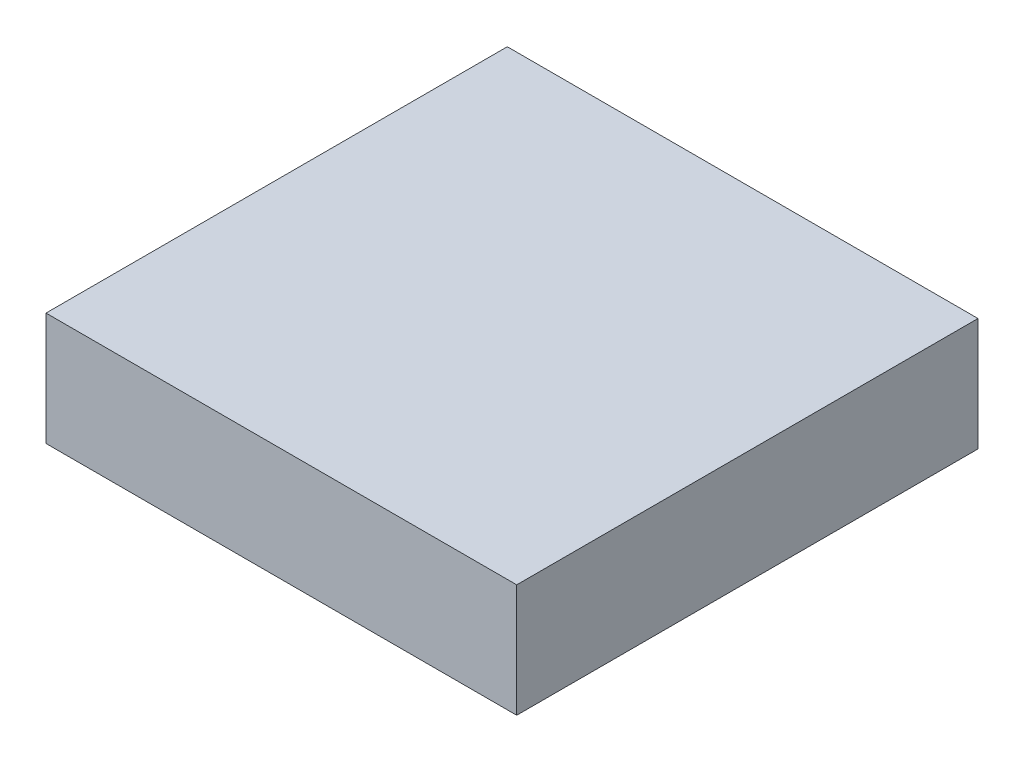
ISO-10303-21;
HEADER;
FILE_DESCRIPTION(('STEP AP214'),'2;1');
FILE_NAME('part.step','',(''),(''),'','','');
FILE_SCHEMA(('AUTOMOTIVE_DESIGN { 1 0 10303 214 1 1 1 1 }'));
ENDSEC;
DATA;
#1=APPLICATION_CONTEXT('core data for automotive mechanical design processes');
#2=APPLICATION_PROTOCOL_DEFINITION('international standard','automotive_design',2000,#1);
#3=PRODUCT_CONTEXT('',#1,'mechanical');
#4=PRODUCT('Part','Part','',(#3));
#5=PRODUCT_RELATED_PRODUCT_CATEGORY('part','',(#4));
#6=PRODUCT_DEFINITION_FORMATION('','',#4);
#7=PRODUCT_DEFINITION_CONTEXT('part definition',#1,'design');
#8=PRODUCT_DEFINITION('design','',#6,#7);
#9=PRODUCT_DEFINITION_SHAPE('','',#8);
#10=(LENGTH_UNIT() NAMED_UNIT(*) SI_UNIT(.MILLI.,.METRE.));
#11=(NAMED_UNIT(*) PLANE_ANGLE_UNIT() SI_UNIT($,.RADIAN.));
#12=(NAMED_UNIT(*) SI_UNIT($,.STERADIAN.) SOLID_ANGLE_UNIT());
#13=UNCERTAINTY_MEASURE_WITH_UNIT(LENGTH_MEASURE(1.E-05),#10,'distance_accuracy_value','');
#14=(GEOMETRIC_REPRESENTATION_CONTEXT(3) GLOBAL_UNCERTAINTY_ASSIGNED_CONTEXT((#13)) GLOBAL_UNIT_ASSIGNED_CONTEXT((#10,
#11,#12)) REPRESENTATION_CONTEXT('',''));
#15=CARTESIAN_POINT('',(0.,0.,0.));
#16=DIRECTION('',(0.,0.,1.));
#17=DIRECTION('',(1.,0.,0.));
#18=AXIS2_PLACEMENT_3D('',#15,#16,#17);
#19=CARTESIAN_POINT('',(746.092694530047,-638.133069256736,285.341324502086));
#20=DIRECTION('',(1.,0.,0.));
#21=DIRECTION('',(0.,0.,-1.));
#22=AXIS2_PLACEMENT_3D('',#19,#20,#21);
#23=PLANE('',#22);
#24=DIRECTION('',(0.,0.,1.));
#25=VECTOR('',#24,1.);
#26=CARTESIAN_POINT('',(746.092694530047,-662.133069256736,285.341324502086));
#27=LINE('',#26,#25);
#28=CARTESIAN_POINT('',(746.092694530047,-662.133069256736,187.341324502086));
#29=VERTEX_POINT('',#28);
#30=CARTESIAN_POINT('',(746.092694530047,-662.133069256736,285.341324502086));
#31=VERTEX_POINT('',#30);
#32=EDGE_CURVE('E96',#29,#31,#27,.T.);
#33=ORIENTED_EDGE('',*,*,#32,.T.);
#34=DIRECTION('',(0.,-1.,0.));
#35=VECTOR('',#34,1.);
#36=CARTESIAN_POINT('',(746.092694530047,-638.133069256736,285.341324502086));
#37=LINE('',#36,#35);
#38=CARTESIAN_POINT('',(746.092694530047,-638.133069256736,285.341324502086));
#39=VERTEX_POINT('',#38);
#40=EDGE_CURVE('E11',#39,#31,#37,.T.);
#41=ORIENTED_EDGE('',*,*,#40,.F.);
#42=DIRECTION('',(0.,0.,1.));
#43=VECTOR('',#42,1.);
#44=CARTESIAN_POINT('',(746.092694530047,-638.133069256736,285.341324502086));
#45=LINE('',#44,#43);
#46=CARTESIAN_POINT('',(746.092694530047,-638.133069256736,187.341324502086));
#47=VERTEX_POINT('',#46);
#48=EDGE_CURVE('E84',#47,#39,#45,.T.);
#49=ORIENTED_EDGE('',*,*,#48,.F.);
#50=DIRECTION('',(0.,-1.,0.));
#51=VECTOR('',#50,1.);
#52=CARTESIAN_POINT('',(746.092694530047,-638.133069256736,187.341324502086));
#53=LINE('',#52,#51);
#54=EDGE_CURVE('E92',#47,#29,#53,.T.);
#55=ORIENTED_EDGE('',*,*,#54,.T.);
#56=EDGE_LOOP('',(#33,#41,#49,#55));
#57=FACE_BOUND('',#56,.T.);
#58=ADVANCED_FACE('F33',(#57),#23,.F.);
#59=CARTESIAN_POINT('',(746.092694530047,-638.133069256736,285.341324502086));
#60=DIRECTION('',(0.,0.,-1.));
#61=DIRECTION('',(-1.,0.,0.));
#62=AXIS2_PLACEMENT_3D('',#59,#60,#61);
#63=PLANE('',#62);
#64=DIRECTION('',(1.,0.,0.));
#65=VECTOR('',#64,1.);
#66=CARTESIAN_POINT('',(746.092694530047,-662.133069256736,285.341324502086));
#67=LINE('',#66,#65);
#68=CARTESIAN_POINT('',(846.092694530047,-662.133069256736,285.341324502086));
#69=VERTEX_POINT('',#68);
#70=EDGE_CURVE('E88',#31,#69,#67,.T.);
#71=ORIENTED_EDGE('',*,*,#70,.T.);
#72=DIRECTION('',(0.,-1.,0.));
#73=VECTOR('',#72,1.);
#74=CARTESIAN_POINT('',(846.092694530047,-638.133069256736,285.341324502086));
#75=LINE('',#74,#73);
#76=CARTESIAN_POINT('',(846.092694530047,-638.133069256736,285.341324502086));
#77=VERTEX_POINT('',#76);
#78=EDGE_CURVE('E41',#77,#69,#75,.T.);
#79=ORIENTED_EDGE('',*,*,#78,.F.);
#80=DIRECTION('',(1.,0.,0.));
#81=VECTOR('',#80,1.);
#82=CARTESIAN_POINT('',(746.092694530047,-638.133069256736,285.341324502086));
#83=LINE('',#82,#81);
#84=EDGE_CURVE('E79',#39,#77,#83,.T.);
#85=ORIENTED_EDGE('',*,*,#84,.F.);
#86=ORIENTED_EDGE('',*,*,#40,.T.);
#87=EDGE_LOOP('',(#71,#79,#85,#86));
#88=FACE_BOUND('',#87,.T.);
#89=ADVANCED_FACE('F87',(#88),#63,.F.);
#90=CARTESIAN_POINT('',(846.092694530047,-638.133069256736,285.341324502086));
#91=DIRECTION('',(-1.,0.,0.));
#92=DIRECTION('',(0.,0.,1.));
#93=AXIS2_PLACEMENT_3D('',#90,#91,#92);
#94=PLANE('',#93);
#95=DIRECTION('',(0.,0.,-1.));
#96=VECTOR('',#95,1.);
#97=CARTESIAN_POINT('',(846.092694530047,-662.133069256736,285.341324502086));
#98=LINE('',#97,#96);
#99=CARTESIAN_POINT('',(846.092694530047,-662.133069256736,187.341324502086));
#100=VERTEX_POINT('',#99);
#101=EDGE_CURVE('E66',#69,#100,#98,.T.);
#102=ORIENTED_EDGE('',*,*,#101,.T.);
#103=DIRECTION('',(0.,-1.,0.));
#104=VECTOR('',#103,1.);
#105=CARTESIAN_POINT('',(846.092694530047,-638.133069256736,187.341324502086));
#106=LINE('',#105,#104);
#107=CARTESIAN_POINT('',(846.092694530047,-638.133069256736,187.341324502086));
#108=VERTEX_POINT('',#107);
#109=EDGE_CURVE('E89',#108,#100,#106,.T.);
#110=ORIENTED_EDGE('',*,*,#109,.F.);
#111=DIRECTION('',(0.,0.,-1.));
#112=VECTOR('',#111,1.);
#113=CARTESIAN_POINT('',(846.092694530047,-638.133069256736,285.341324502086));
#114=LINE('',#113,#112);
#115=EDGE_CURVE('E82',#77,#108,#114,.T.);
#116=ORIENTED_EDGE('',*,*,#115,.F.);
#117=ORIENTED_EDGE('',*,*,#78,.T.);
#118=EDGE_LOOP('',(#102,#110,#116,#117));
#119=FACE_BOUND('',#118,.T.);
#120=ADVANCED_FACE('F90',(#119),#94,.F.);
#121=CARTESIAN_POINT('',(746.092694530047,-638.133069256736,187.341324502086));
#122=DIRECTION('',(0.,0.,1.));
#123=DIRECTION('',(1.,0.,0.));
#124=AXIS2_PLACEMENT_3D('',#121,#122,#123);
#125=PLANE('',#124);
#126=DIRECTION('',(-1.,0.,0.));
#127=VECTOR('',#126,1.);
#128=CARTESIAN_POINT('',(746.092694530047,-662.133069256736,187.341324502086));
#129=LINE('',#128,#127);
#130=EDGE_CURVE('E72',#100,#29,#129,.T.);
#131=ORIENTED_EDGE('',*,*,#130,.T.);
#132=ORIENTED_EDGE('',*,*,#54,.F.);
#133=DIRECTION('',(-1.,0.,0.));
#134=VECTOR('',#133,1.);
#135=CARTESIAN_POINT('',(746.092694530047,-638.133069256736,187.341324502086));
#136=LINE('',#135,#134);
#137=EDGE_CURVE('E49',#108,#47,#136,.T.);
#138=ORIENTED_EDGE('',*,*,#137,.F.);
#139=ORIENTED_EDGE('',*,*,#109,.T.);
#140=EDGE_LOOP('',(#131,#132,#138,#139));
#141=FACE_BOUND('',#140,.T.);
#142=ADVANCED_FACE('F103',(#141),#125,.F.);
#143=CARTESIAN_POINT('',(0.,-638.133069256736,0.));
#144=DIRECTION('',(0.,-1.,0.));
#145=DIRECTION('',(0.,0.,-1.));
#146=AXIS2_PLACEMENT_3D('',#143,#144,#145);
#147=PLANE('',#146);
#148=ORIENTED_EDGE('',*,*,#48,.T.);
#149=ORIENTED_EDGE('',*,*,#84,.T.);
#150=ORIENTED_EDGE('',*,*,#115,.T.);
#151=ORIENTED_EDGE('',*,*,#137,.T.);
#152=EDGE_LOOP('',(#148,#149,#150,#151));
#153=FACE_BOUND('',#152,.T.);
#154=ADVANCED_FACE('F80',(#153),#147,.F.);
#155=CARTESIAN_POINT('',(0.,-662.133069256736,0.));
#156=DIRECTION('',(0.,-1.,0.));
#157=DIRECTION('',(0.,0.,-1.));
#158=AXIS2_PLACEMENT_3D('',#155,#156,#157);
#159=PLANE('',#158);
#160=ORIENTED_EDGE('',*,*,#32,.F.);
#161=ORIENTED_EDGE('',*,*,#130,.F.);
#162=ORIENTED_EDGE('',*,*,#101,.F.);
#163=ORIENTED_EDGE('',*,*,#70,.F.);
#164=EDGE_LOOP('',(#160,#161,#162,#163));
#165=FACE_BOUND('',#164,.T.);
#166=ADVANCED_FACE('F106',(#165),#159,.T.);
#167=CLOSED_SHELL('',(#58,#89,#120,#142,#154,#166));
#168=MANIFOLD_SOLID_BREP('B2',#167);
#169=ADVANCED_BREP_SHAPE_REPRESENTATION('',(#18,#168),#14);
#170=SHAPE_DEFINITION_REPRESENTATION(#9,#169);
ENDSEC;
END-ISO-10303-21;
